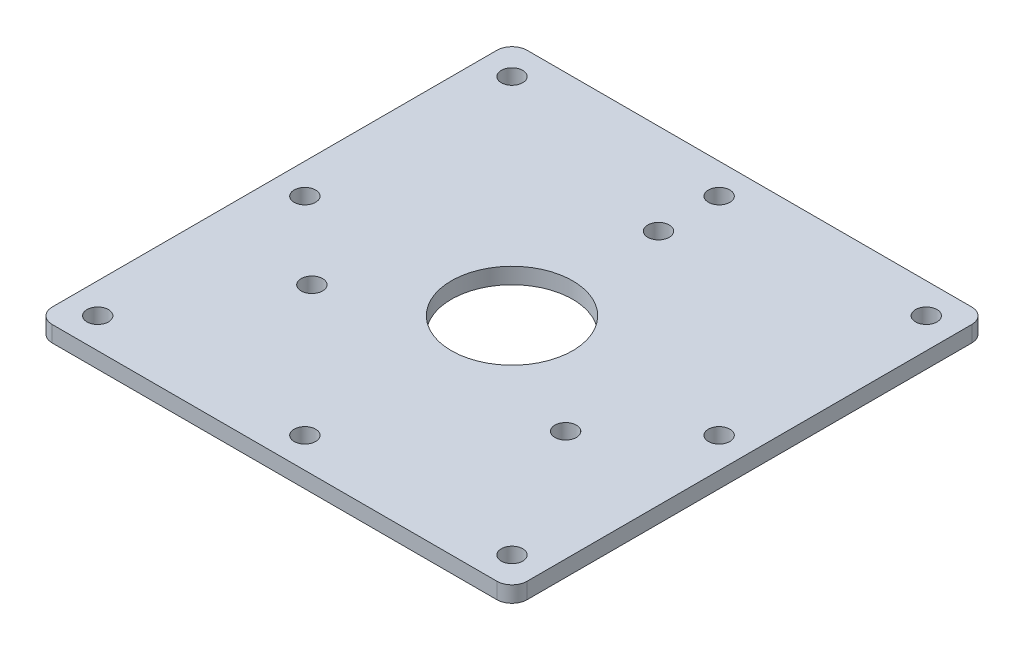
ISO-10303-21;
HEADER;
FILE_DESCRIPTION(('STEP AP214'),'2;1');
FILE_NAME('part.step','',(''),(''),'','','');
FILE_SCHEMA(('AUTOMOTIVE_DESIGN { 1 0 10303 214 1 1 1 1 }'));
ENDSEC;
DATA;
#1=APPLICATION_CONTEXT('core data for automotive mechanical design processes');
#2=APPLICATION_PROTOCOL_DEFINITION('international standard','automotive_design',2000,#1);
#3=PRODUCT_CONTEXT('',#1,'mechanical');
#4=PRODUCT('Part','Part','',(#3));
#5=PRODUCT_RELATED_PRODUCT_CATEGORY('part','',(#4));
#6=PRODUCT_DEFINITION_FORMATION('','',#4);
#7=PRODUCT_DEFINITION_CONTEXT('part definition',#1,'design');
#8=PRODUCT_DEFINITION('design','',#6,#7);
#9=PRODUCT_DEFINITION_SHAPE('','',#8);
#10=(LENGTH_UNIT() NAMED_UNIT(*) SI_UNIT(.MILLI.,.METRE.));
#11=(NAMED_UNIT(*) PLANE_ANGLE_UNIT() SI_UNIT($,.RADIAN.));
#12=(NAMED_UNIT(*) SI_UNIT($,.STERADIAN.) SOLID_ANGLE_UNIT());
#13=UNCERTAINTY_MEASURE_WITH_UNIT(LENGTH_MEASURE(1.E-05),#10,'distance_accuracy_value','');
#14=(GEOMETRIC_REPRESENTATION_CONTEXT(3) GLOBAL_UNCERTAINTY_ASSIGNED_CONTEXT((#13)) GLOBAL_UNIT_ASSIGNED_CONTEXT((#10,
#11,#12)) REPRESENTATION_CONTEXT('',''));
#15=CARTESIAN_POINT('',(0.,0.,0.));
#16=DIRECTION('',(0.,0.,1.));
#17=DIRECTION('',(1.,0.,0.));
#18=AXIS2_PLACEMENT_3D('',#15,#16,#17);
#19=CARTESIAN_POINT('',(0.,3.175,0.));
#20=DIRECTION('',(0.,-1.,0.));
#21=DIRECTION('',(0.,0.,-1.));
#22=AXIS2_PLACEMENT_3D('',#19,#20,#21);
#23=PLANE('',#22);
#24=DIRECTION('',(-1.,0.,0.));
#25=VECTOR('',#24,1.);
#26=CARTESIAN_POINT('',(-47.,3.175,-47.));
#27=LINE('',#26,#25);
#28=CARTESIAN_POINT('',(44.,3.175,-47.));
#29=VERTEX_POINT('',#28);
#30=CARTESIAN_POINT('',(-44.,3.175,-47.));
#31=VERTEX_POINT('',#30);
#32=EDGE_CURVE('E200',#29,#31,#27,.T.);
#33=ORIENTED_EDGE('',*,*,#32,.T.);
#34=CARTESIAN_POINT('',(-44.,3.175,-44.));
#35=DIRECTION('',(0.,-1.,0.));
#36=DIRECTION('',(0.,0.,-1.));
#37=AXIS2_PLACEMENT_3D('',#34,#35,#36);
#38=CIRCLE('',#37,3.);
#39=CARTESIAN_POINT('',(-47.,3.175,-44.));
#40=VERTEX_POINT('',#39);
#41=EDGE_CURVE('E173',#31,#40,#38,.F.);
#42=ORIENTED_EDGE('',*,*,#41,.T.);
#43=DIRECTION('',(0.,0.,1.));
#44=VECTOR('',#43,1.);
#45=CARTESIAN_POINT('',(-47.,3.175,47.));
#46=LINE('',#45,#44);
#47=CARTESIAN_POINT('',(-47.,3.175,44.));
#48=VERTEX_POINT('',#47);
#49=EDGE_CURVE('E130',#40,#48,#46,.T.);
#50=ORIENTED_EDGE('',*,*,#49,.T.);
#51=CARTESIAN_POINT('',(-44.,3.175,44.));
#52=DIRECTION('',(0.,-1.,0.));
#53=DIRECTION('',(0.,0.,-1.));
#54=AXIS2_PLACEMENT_3D('',#51,#52,#53);
#55=CIRCLE('',#54,3.);
#56=CARTESIAN_POINT('',(-44.,3.175,47.));
#57=VERTEX_POINT('',#56);
#58=EDGE_CURVE('E65',#48,#57,#55,.F.);
#59=ORIENTED_EDGE('',*,*,#58,.T.);
#60=DIRECTION('',(1.,0.,0.));
#61=VECTOR('',#60,1.);
#62=CARTESIAN_POINT('',(-47.,3.175,47.));
#63=LINE('',#62,#61);
#64=CARTESIAN_POINT('',(44.,3.175,47.));
#65=VERTEX_POINT('',#64);
#66=EDGE_CURVE('E151',#57,#65,#63,.T.);
#67=ORIENTED_EDGE('',*,*,#66,.T.);
#68=CARTESIAN_POINT('',(44.,3.175,44.));
#69=DIRECTION('',(0.,-1.,0.));
#70=DIRECTION('',(0.,0.,-1.));
#71=AXIS2_PLACEMENT_3D('',#68,#69,#70);
#72=CIRCLE('',#71,3.);
#73=CARTESIAN_POINT('',(47.,3.175,44.));
#74=VERTEX_POINT('',#73);
#75=EDGE_CURVE('E170',#65,#74,#72,.F.);
#76=ORIENTED_EDGE('',*,*,#75,.T.);
#77=DIRECTION('',(0.,0.,-1.));
#78=VECTOR('',#77,1.);
#79=CARTESIAN_POINT('',(47.,3.175,47.));
#80=LINE('',#79,#78);
#81=CARTESIAN_POINT('',(47.,3.175,-44.));
#82=VERTEX_POINT('',#81);
#83=EDGE_CURVE('E144',#74,#82,#80,.T.);
#84=ORIENTED_EDGE('',*,*,#83,.T.);
#85=CARTESIAN_POINT('',(44.,3.175,-44.));
#86=DIRECTION('',(0.,-1.,0.));
#87=DIRECTION('',(0.,0.,-1.));
#88=AXIS2_PLACEMENT_3D('',#85,#86,#87);
#89=CIRCLE('',#88,3.);
#90=EDGE_CURVE('E167',#82,#29,#89,.F.);
#91=ORIENTED_EDGE('',*,*,#90,.T.);
#92=EDGE_LOOP('',(#33,#42,#50,#59,#67,#76,#84,#91));
#93=FACE_BOUND('',#92,.T.);
#94=CARTESIAN_POINT('',(0.,3.175,0.));
#95=DIRECTION('',(0.,1.,0.));
#96=DIRECTION('',(0.,0.,1.));
#97=AXIS2_PLACEMENT_3D('',#94,#95,#96);
#98=CIRCLE('',#97,12.);
#99=CARTESIAN_POINT('',(0.,3.175,12.));
#100=VERTEX_POINT('',#99);
#101=EDGE_CURVE('E213',#100,#100,#98,.T.);
#102=ORIENTED_EDGE('',*,*,#101,.F.);
#103=EDGE_LOOP('',(#102));
#104=FACE_BOUND('',#103,.T.);
#105=CARTESIAN_POINT('',(0.,3.175,-29.));
#106=DIRECTION('',(0.,1.,0.));
#107=DIRECTION('',(0.,0.,1.));
#108=AXIS2_PLACEMENT_3D('',#105,#106,#107);
#109=CIRCLE('',#108,2.125);
#110=CARTESIAN_POINT('',(0.,3.175,-26.875));
#111=VERTEX_POINT('',#110);
#112=EDGE_CURVE('E220',#111,#111,#109,.T.);
#113=ORIENTED_EDGE('',*,*,#112,.F.);
#114=EDGE_LOOP('',(#113));
#115=FACE_BOUND('',#114,.T.);
#116=CARTESIAN_POINT('',(-41.,3.175,41.));
#117=DIRECTION('',(0.,1.,0.));
#118=DIRECTION('',(0.,0.,1.));
#119=AXIS2_PLACEMENT_3D('',#116,#117,#118);
#120=CIRCLE('',#119,2.125);
#121=CARTESIAN_POINT('',(-41.,3.175,43.125));
#122=VERTEX_POINT('',#121);
#123=EDGE_CURVE('E226',#122,#122,#120,.T.);
#124=ORIENTED_EDGE('',*,*,#123,.F.);
#125=EDGE_LOOP('',(#124));
#126=FACE_BOUND('',#125,.T.);
#127=CARTESIAN_POINT('',(25.1147367097506,3.175,14.4999999999989));
#128=DIRECTION('',(0.,1.,0.));
#129=DIRECTION('',(0.,0.,1.));
#130=AXIS2_PLACEMENT_3D('',#127,#128,#129);
#131=CIRCLE('',#130,2.12500000000159);
#132=CARTESIAN_POINT('',(25.1147367097506,3.175,16.6250000000005));
#133=VERTEX_POINT('',#132);
#134=EDGE_CURVE('E234',#133,#133,#131,.T.);
#135=ORIENTED_EDGE('',*,*,#134,.F.);
#136=EDGE_LOOP('',(#135));
#137=FACE_BOUND('',#136,.T.);
#138=CARTESIAN_POINT('',(-25.1147367097469,3.175,14.5000000000011));
#139=DIRECTION('',(0.,1.,0.));
#140=DIRECTION('',(0.,0.,1.));
#141=AXIS2_PLACEMENT_3D('',#138,#139,#140);
#142=CIRCLE('',#141,2.12500000000233);
#143=CARTESIAN_POINT('',(-25.1147367097469,3.175,16.6250000000034));
#144=VERTEX_POINT('',#143);
#145=EDGE_CURVE('E242',#144,#144,#142,.T.);
#146=ORIENTED_EDGE('',*,*,#145,.F.);
#147=EDGE_LOOP('',(#146));
#148=FACE_BOUND('',#147,.T.);
#149=CARTESIAN_POINT('',(-41.,3.175,0.));
#150=DIRECTION('',(0.,1.,0.));
#151=DIRECTION('',(0.,0.,1.));
#152=AXIS2_PLACEMENT_3D('',#149,#150,#151);
#153=CIRCLE('',#152,2.125);
#154=CARTESIAN_POINT('',(-41.,3.175,2.125));
#155=VERTEX_POINT('',#154);
#156=EDGE_CURVE('E250',#155,#155,#153,.T.);
#157=ORIENTED_EDGE('',*,*,#156,.F.);
#158=EDGE_LOOP('',(#157));
#159=FACE_BOUND('',#158,.T.);
#160=CARTESIAN_POINT('',(-41.,3.175,-41.));
#161=DIRECTION('',(0.,1.,0.));
#162=DIRECTION('',(0.,0.,-1.));
#163=AXIS2_PLACEMENT_3D('',#160,#161,#162);
#164=CIRCLE('',#163,2.125);
#165=CARTESIAN_POINT('',(-41.,3.175,-43.125));
#166=VERTEX_POINT('',#165);
#167=EDGE_CURVE('E258',#166,#166,#164,.T.);
#168=ORIENTED_EDGE('',*,*,#167,.F.);
#169=EDGE_LOOP('',(#168));
#170=FACE_BOUND('',#169,.T.);
#171=CARTESIAN_POINT('',(41.,3.175,41.));
#172=DIRECTION('',(0.,1.,0.));
#173=DIRECTION('',(0.,0.,-1.));
#174=AXIS2_PLACEMENT_3D('',#171,#172,#173);
#175=CIRCLE('',#174,2.125);
#176=CARTESIAN_POINT('',(41.,3.175,38.875));
#177=VERTEX_POINT('',#176);
#178=EDGE_CURVE('E266',#177,#177,#175,.T.);
#179=ORIENTED_EDGE('',*,*,#178,.F.);
#180=EDGE_LOOP('',(#179));
#181=FACE_BOUND('',#180,.T.);
#182=CARTESIAN_POINT('',(41.,3.175,0.));
#183=DIRECTION('',(0.,1.,0.));
#184=DIRECTION('',(0.,0.,-1.));
#185=AXIS2_PLACEMENT_3D('',#182,#183,#184);
#186=CIRCLE('',#185,2.125);
#187=CARTESIAN_POINT('',(41.,3.175,-2.125));
#188=VERTEX_POINT('',#187);
#189=EDGE_CURVE('E274',#188,#188,#186,.T.);
#190=ORIENTED_EDGE('',*,*,#189,.F.);
#191=EDGE_LOOP('',(#190));
#192=FACE_BOUND('',#191,.T.);
#193=CARTESIAN_POINT('',(41.,3.175,-41.));
#194=DIRECTION('',(0.,1.,0.));
#195=DIRECTION('',(0.,0.,1.));
#196=AXIS2_PLACEMENT_3D('',#193,#194,#195);
#197=CIRCLE('',#196,2.125);
#198=CARTESIAN_POINT('',(41.,3.175,-38.875));
#199=VERTEX_POINT('',#198);
#200=EDGE_CURVE('E282',#199,#199,#197,.T.);
#201=ORIENTED_EDGE('',*,*,#200,.F.);
#202=EDGE_LOOP('',(#201));
#203=FACE_BOUND('',#202,.T.);
#204=CARTESIAN_POINT('',(0.,3.175,41.));
#205=DIRECTION('',(0.,1.,0.));
#206=DIRECTION('',(0.,0.,1.));
#207=AXIS2_PLACEMENT_3D('',#204,#205,#206);
#208=CIRCLE('',#207,2.125);
#209=CARTESIAN_POINT('',(0.,3.175,43.125));
#210=VERTEX_POINT('',#209);
#211=EDGE_CURVE('E290',#210,#210,#208,.T.);
#212=ORIENTED_EDGE('',*,*,#211,.F.);
#213=EDGE_LOOP('',(#212));
#214=FACE_BOUND('',#213,.T.);
#215=CARTESIAN_POINT('',(0.,3.175,-41.));
#216=DIRECTION('',(0.,1.,0.));
#217=DIRECTION('',(0.,0.,-1.));
#218=AXIS2_PLACEMENT_3D('',#215,#216,#217);
#219=CIRCLE('',#218,2.125);
#220=CARTESIAN_POINT('',(0.,3.175,-43.125));
#221=VERTEX_POINT('',#220);
#222=EDGE_CURVE('E298',#221,#221,#219,.T.);
#223=ORIENTED_EDGE('',*,*,#222,.F.);
#224=EDGE_LOOP('',(#223));
#225=FACE_BOUND('',#224,.T.);
#226=ADVANCED_FACE('F44',(#93,#104,#115,#126,#137,#148,#159,#170,#181,#192,#203,#214,#225),#23,.F.);
#227=CARTESIAN_POINT('',(0.,0.,0.));
#228=DIRECTION('',(0.,-1.,0.));
#229=DIRECTION('',(0.,0.,-1.));
#230=AXIS2_PLACEMENT_3D('',#227,#228,#229);
#231=PLANE('',#230);
#232=CARTESIAN_POINT('',(0.,0.,41.));
#233=DIRECTION('',(0.,1.,0.));
#234=DIRECTION('',(0.,0.,1.));
#235=AXIS2_PLACEMENT_3D('',#232,#233,#234);
#236=CIRCLE('',#235,2.125);
#237=CARTESIAN_POINT('',(0.,0.,43.125));
#238=VERTEX_POINT('',#237);
#239=EDGE_CURVE('E294',#238,#238,#236,.T.);
#240=ORIENTED_EDGE('',*,*,#239,.T.);
#241=EDGE_LOOP('',(#240));
#242=FACE_BOUND('',#241,.T.);
#243=CARTESIAN_POINT('',(41.,0.,0.));
#244=DIRECTION('',(0.,1.,0.));
#245=DIRECTION('',(0.,0.,-1.));
#246=AXIS2_PLACEMENT_3D('',#243,#244,#245);
#247=CIRCLE('',#246,2.125);
#248=CARTESIAN_POINT('',(41.,0.,-2.125));
#249=VERTEX_POINT('',#248);
#250=EDGE_CURVE('E278',#249,#249,#247,.T.);
#251=ORIENTED_EDGE('',*,*,#250,.T.);
#252=EDGE_LOOP('',(#251));
#253=FACE_BOUND('',#252,.T.);
#254=CARTESIAN_POINT('',(-41.,0.,-41.));
#255=DIRECTION('',(0.,1.,0.));
#256=DIRECTION('',(0.,0.,-1.));
#257=AXIS2_PLACEMENT_3D('',#254,#255,#256);
#258=CIRCLE('',#257,2.125);
#259=CARTESIAN_POINT('',(-41.,0.,-43.125));
#260=VERTEX_POINT('',#259);
#261=EDGE_CURVE('E262',#260,#260,#258,.T.);
#262=ORIENTED_EDGE('',*,*,#261,.T.);
#263=EDGE_LOOP('',(#262));
#264=FACE_BOUND('',#263,.T.);
#265=CARTESIAN_POINT('',(-25.1147367097469,0.,14.5000000000011));
#266=DIRECTION('',(0.,1.,0.));
#267=DIRECTION('',(0.,0.,1.));
#268=AXIS2_PLACEMENT_3D('',#265,#266,#267);
#269=CIRCLE('',#268,2.12500000000233);
#270=CARTESIAN_POINT('',(-25.1147367097469,0.,16.6250000000034));
#271=VERTEX_POINT('',#270);
#272=EDGE_CURVE('E246',#271,#271,#269,.T.);
#273=ORIENTED_EDGE('',*,*,#272,.T.);
#274=EDGE_LOOP('',(#273));
#275=FACE_BOUND('',#274,.T.);
#276=CARTESIAN_POINT('',(-41.,0.,41.));
#277=DIRECTION('',(0.,1.,0.));
#278=DIRECTION('',(0.,0.,1.));
#279=AXIS2_PLACEMENT_3D('',#276,#277,#278);
#280=CIRCLE('',#279,2.125);
#281=CARTESIAN_POINT('',(-41.,0.,43.125));
#282=VERTEX_POINT('',#281);
#283=EDGE_CURVE('E230',#282,#282,#280,.T.);
#284=ORIENTED_EDGE('',*,*,#283,.T.);
#285=EDGE_LOOP('',(#284));
#286=FACE_BOUND('',#285,.T.);
#287=CARTESIAN_POINT('',(0.,0.,0.));
#288=DIRECTION('',(0.,1.,0.));
#289=DIRECTION('',(0.,0.,1.));
#290=AXIS2_PLACEMENT_3D('',#287,#288,#289);
#291=CIRCLE('',#290,12.);
#292=CARTESIAN_POINT('',(0.,0.,12.));
#293=VERTEX_POINT('',#292);
#294=EDGE_CURVE('E206',#293,#293,#291,.T.);
#295=ORIENTED_EDGE('',*,*,#294,.T.);
#296=EDGE_LOOP('',(#295));
#297=FACE_BOUND('',#296,.T.);
#298=DIRECTION('',(0.,0.,1.));
#299=VECTOR('',#298,1.);
#300=CARTESIAN_POINT('',(-47.,0.,47.));
#301=LINE('',#300,#299);
#302=CARTESIAN_POINT('',(-47.,0.,-44.));
#303=VERTEX_POINT('',#302);
#304=CARTESIAN_POINT('',(-47.,0.,44.));
#305=VERTEX_POINT('',#304);
#306=EDGE_CURVE('E128',#303,#305,#301,.T.);
#307=ORIENTED_EDGE('',*,*,#306,.F.);
#308=CARTESIAN_POINT('',(-44.,0.,-44.));
#309=DIRECTION('',(0.,-1.,0.));
#310=DIRECTION('',(0.,0.,-1.));
#311=AXIS2_PLACEMENT_3D('',#308,#309,#310);
#312=CIRCLE('',#311,3.);
#313=CARTESIAN_POINT('',(-44.,0.,-47.));
#314=VERTEX_POINT('',#313);
#315=EDGE_CURVE('E110',#303,#314,#312,.T.);
#316=ORIENTED_EDGE('',*,*,#315,.T.);
#317=DIRECTION('',(-1.,0.,0.));
#318=VECTOR('',#317,1.);
#319=CARTESIAN_POINT('',(-47.,0.,-47.));
#320=LINE('',#319,#318);
#321=CARTESIAN_POINT('',(44.,0.,-47.));
#322=VERTEX_POINT('',#321);
#323=EDGE_CURVE('E140',#322,#314,#320,.T.);
#324=ORIENTED_EDGE('',*,*,#323,.F.);
#325=CARTESIAN_POINT('',(44.,0.,-44.));
#326=DIRECTION('',(0.,-1.,0.));
#327=DIRECTION('',(0.,0.,-1.));
#328=AXIS2_PLACEMENT_3D('',#325,#326,#327);
#329=CIRCLE('',#328,3.);
#330=CARTESIAN_POINT('',(47.,0.,-44.));
#331=VERTEX_POINT('',#330);
#332=EDGE_CURVE('E155',#322,#331,#329,.T.);
#333=ORIENTED_EDGE('',*,*,#332,.T.);
#334=DIRECTION('',(0.,0.,-1.));
#335=VECTOR('',#334,1.);
#336=CARTESIAN_POINT('',(47.,0.,47.));
#337=LINE('',#336,#335);
#338=CARTESIAN_POINT('',(47.,0.,44.));
#339=VERTEX_POINT('',#338);
#340=EDGE_CURVE('E146',#339,#331,#337,.T.);
#341=ORIENTED_EDGE('',*,*,#340,.F.);
#342=CARTESIAN_POINT('',(44.,0.,44.));
#343=DIRECTION('',(0.,-1.,0.));
#344=DIRECTION('',(0.,0.,-1.));
#345=AXIS2_PLACEMENT_3D('',#342,#343,#344);
#346=CIRCLE('',#345,3.);
#347=CARTESIAN_POINT('',(44.,0.,47.));
#348=VERTEX_POINT('',#347);
#349=EDGE_CURVE('E122',#339,#348,#346,.T.);
#350=ORIENTED_EDGE('',*,*,#349,.T.);
#351=DIRECTION('',(1.,0.,0.));
#352=VECTOR('',#351,1.);
#353=CARTESIAN_POINT('',(-47.,0.,47.));
#354=LINE('',#353,#352);
#355=CARTESIAN_POINT('',(-44.,0.,47.));
#356=VERTEX_POINT('',#355);
#357=EDGE_CURVE('E139',#356,#348,#354,.T.);
#358=ORIENTED_EDGE('',*,*,#357,.F.);
#359=CARTESIAN_POINT('',(-44.,0.,44.));
#360=DIRECTION('',(0.,-1.,0.));
#361=DIRECTION('',(0.,0.,-1.));
#362=AXIS2_PLACEMENT_3D('',#359,#360,#361);
#363=CIRCLE('',#362,3.);
#364=EDGE_CURVE('E132',#356,#305,#363,.T.);
#365=ORIENTED_EDGE('',*,*,#364,.T.);
#366=EDGE_LOOP('',(#307,#316,#324,#333,#341,#350,#358,#365));
#367=FACE_BOUND('',#366,.T.);
#368=CARTESIAN_POINT('',(0.,0.,-29.));
#369=DIRECTION('',(0.,1.,0.));
#370=DIRECTION('',(0.,0.,1.));
#371=AXIS2_PLACEMENT_3D('',#368,#369,#370);
#372=CIRCLE('',#371,2.125);
#373=CARTESIAN_POINT('',(0.,0.,-26.875));
#374=VERTEX_POINT('',#373);
#375=EDGE_CURVE('E222',#374,#374,#372,.T.);
#376=ORIENTED_EDGE('',*,*,#375,.T.);
#377=EDGE_LOOP('',(#376));
#378=FACE_BOUND('',#377,.T.);
#379=CARTESIAN_POINT('',(25.1147367097506,0.,14.4999999999989));
#380=DIRECTION('',(0.,1.,0.));
#381=DIRECTION('',(0.,0.,1.));
#382=AXIS2_PLACEMENT_3D('',#379,#380,#381);
#383=CIRCLE('',#382,2.12500000000159);
#384=CARTESIAN_POINT('',(25.1147367097506,0.,16.6250000000005));
#385=VERTEX_POINT('',#384);
#386=EDGE_CURVE('E238',#385,#385,#383,.T.);
#387=ORIENTED_EDGE('',*,*,#386,.T.);
#388=EDGE_LOOP('',(#387));
#389=FACE_BOUND('',#388,.T.);
#390=CARTESIAN_POINT('',(-41.,0.,0.));
#391=DIRECTION('',(0.,1.,0.));
#392=DIRECTION('',(0.,0.,1.));
#393=AXIS2_PLACEMENT_3D('',#390,#391,#392);
#394=CIRCLE('',#393,2.125);
#395=CARTESIAN_POINT('',(-41.,0.,2.125));
#396=VERTEX_POINT('',#395);
#397=EDGE_CURVE('E254',#396,#396,#394,.T.);
#398=ORIENTED_EDGE('',*,*,#397,.T.);
#399=EDGE_LOOP('',(#398));
#400=FACE_BOUND('',#399,.T.);
#401=CARTESIAN_POINT('',(41.,0.,41.));
#402=DIRECTION('',(0.,1.,0.));
#403=DIRECTION('',(0.,0.,-1.));
#404=AXIS2_PLACEMENT_3D('',#401,#402,#403);
#405=CIRCLE('',#404,2.125);
#406=CARTESIAN_POINT('',(41.,0.,38.875));
#407=VERTEX_POINT('',#406);
#408=EDGE_CURVE('E270',#407,#407,#405,.T.);
#409=ORIENTED_EDGE('',*,*,#408,.T.);
#410=EDGE_LOOP('',(#409));
#411=FACE_BOUND('',#410,.T.);
#412=CARTESIAN_POINT('',(41.,0.,-41.));
#413=DIRECTION('',(0.,1.,0.));
#414=DIRECTION('',(0.,0.,1.));
#415=AXIS2_PLACEMENT_3D('',#412,#413,#414);
#416=CIRCLE('',#415,2.125);
#417=CARTESIAN_POINT('',(41.,0.,-38.875));
#418=VERTEX_POINT('',#417);
#419=EDGE_CURVE('E286',#418,#418,#416,.T.);
#420=ORIENTED_EDGE('',*,*,#419,.T.);
#421=EDGE_LOOP('',(#420));
#422=FACE_BOUND('',#421,.T.);
#423=CARTESIAN_POINT('',(0.,0.,-41.));
#424=DIRECTION('',(0.,1.,0.));
#425=DIRECTION('',(0.,0.,-1.));
#426=AXIS2_PLACEMENT_3D('',#423,#424,#425);
#427=CIRCLE('',#426,2.125);
#428=CARTESIAN_POINT('',(0.,0.,-43.125));
#429=VERTEX_POINT('',#428);
#430=EDGE_CURVE('E302',#429,#429,#427,.T.);
#431=ORIENTED_EDGE('',*,*,#430,.T.);
#432=EDGE_LOOP('',(#431));
#433=FACE_BOUND('',#432,.T.);
#434=ADVANCED_FACE('F135',(#242,#253,#264,#275,#286,#297,#367,#378,#389,#400,#411,#422,#433),
#231,.T.);
#435=CARTESIAN_POINT('',(47.,3.175,47.));
#436=DIRECTION('',(-1.,0.,0.));
#437=DIRECTION('',(0.,0.,1.));
#438=AXIS2_PLACEMENT_3D('',#435,#436,#437);
#439=PLANE('',#438);
#440=ORIENTED_EDGE('',*,*,#83,.F.);
#441=DIRECTION('',(0.,-1.,0.));
#442=VECTOR('',#441,1.);
#443=CARTESIAN_POINT('',(47.,3.175,44.));
#444=LINE('',#443,#442);
#445=EDGE_CURVE('E179',#74,#339,#444,.T.);
#446=ORIENTED_EDGE('',*,*,#445,.T.);
#447=ORIENTED_EDGE('',*,*,#340,.T.);
#448=DIRECTION('',(0.,-1.,0.));
#449=VECTOR('',#448,1.);
#450=CARTESIAN_POINT('',(47.,3.175,-44.));
#451=LINE('',#450,#449);
#452=EDGE_CURVE('E176',#331,#82,#451,.F.);
#453=ORIENTED_EDGE('',*,*,#452,.T.);
#454=EDGE_LOOP('',(#440,#446,#447,#453));
#455=FACE_BOUND('',#454,.T.);
#456=ADVANCED_FACE('F195',(#455),#439,.F.);
#457=CARTESIAN_POINT('',(-47.,3.175,-47.));
#458=DIRECTION('',(0.,0.,1.));
#459=DIRECTION('',(1.,0.,0.));
#460=AXIS2_PLACEMENT_3D('',#457,#458,#459);
#461=PLANE('',#460);
#462=ORIENTED_EDGE('',*,*,#323,.T.);
#463=DIRECTION('',(0.,-1.,0.));
#464=VECTOR('',#463,1.);
#465=CARTESIAN_POINT('',(-44.,3.175,-47.));
#466=LINE('',#465,#464);
#467=EDGE_CURVE('E115',#314,#31,#466,.F.);
#468=ORIENTED_EDGE('',*,*,#467,.T.);
#469=ORIENTED_EDGE('',*,*,#32,.F.);
#470=DIRECTION('',(0.,-1.,0.));
#471=VECTOR('',#470,1.);
#472=CARTESIAN_POINT('',(44.,3.175,-47.));
#473=LINE('',#472,#471);
#474=EDGE_CURVE('E121',#29,#322,#473,.T.);
#475=ORIENTED_EDGE('',*,*,#474,.T.);
#476=EDGE_LOOP('',(#462,#468,#469,#475));
#477=FACE_BOUND('',#476,.T.);
#478=ADVANCED_FACE('F330',(#477),#461,.F.);
#479=CARTESIAN_POINT('',(-47.,3.175,47.));
#480=DIRECTION('',(1.,0.,0.));
#481=DIRECTION('',(0.,0.,-1.));
#482=AXIS2_PLACEMENT_3D('',#479,#480,#481);
#483=PLANE('',#482);
#484=ORIENTED_EDGE('',*,*,#49,.F.);
#485=DIRECTION('',(0.,-1.,0.));
#486=VECTOR('',#485,1.);
#487=CARTESIAN_POINT('',(-47.,3.175,-44.));
#488=LINE('',#487,#486);
#489=EDGE_CURVE('E114',#40,#303,#488,.T.);
#490=ORIENTED_EDGE('',*,*,#489,.T.);
#491=ORIENTED_EDGE('',*,*,#306,.T.);
#492=DIRECTION('',(0.,-1.,0.));
#493=VECTOR('',#492,1.);
#494=CARTESIAN_POINT('',(-47.,3.175,44.));
#495=LINE('',#494,#493);
#496=EDGE_CURVE('E133',#305,#48,#495,.F.);
#497=ORIENTED_EDGE('',*,*,#496,.T.);
#498=EDGE_LOOP('',(#484,#490,#491,#497));
#499=FACE_BOUND('',#498,.T.);
#500=ADVANCED_FACE('F127',(#499),#483,.F.);
#501=CARTESIAN_POINT('',(-47.,3.175,47.));
#502=DIRECTION('',(0.,0.,-1.));
#503=DIRECTION('',(-1.,0.,0.));
#504=AXIS2_PLACEMENT_3D('',#501,#502,#503);
#505=PLANE('',#504);
#506=ORIENTED_EDGE('',*,*,#357,.T.);
#507=DIRECTION('',(0.,-1.,0.));
#508=VECTOR('',#507,1.);
#509=CARTESIAN_POINT('',(44.,3.175,47.));
#510=LINE('',#509,#508);
#511=EDGE_CURVE('E11',#348,#65,#510,.F.);
#512=ORIENTED_EDGE('',*,*,#511,.T.);
#513=ORIENTED_EDGE('',*,*,#66,.F.);
#514=DIRECTION('',(0.,-1.,0.));
#515=VECTOR('',#514,1.);
#516=CARTESIAN_POINT('',(-44.,3.175,47.));
#517=LINE('',#516,#515);
#518=EDGE_CURVE('E53',#57,#356,#517,.T.);
#519=ORIENTED_EDGE('',*,*,#518,.T.);
#520=EDGE_LOOP('',(#506,#512,#513,#519));
#521=FACE_BOUND('',#520,.T.);
#522=ADVANCED_FACE('F185',(#521),#505,.F.);
#523=CARTESIAN_POINT('',(0.,3.175,0.));
#524=DIRECTION('',(0.,-1.,0.));
#525=DIRECTION('',(0.,0.,-1.));
#526=AXIS2_PLACEMENT_3D('',#523,#524,#525);
#527=CYLINDRICAL_SURFACE('',#526,12.);
#528=ORIENTED_EDGE('',*,*,#101,.T.);
#529=EDGE_LOOP('',(#528));
#530=FACE_BOUND('',#529,.T.);
#531=ORIENTED_EDGE('',*,*,#294,.F.);
#532=EDGE_LOOP('',(#531));
#533=FACE_BOUND('',#532,.T.);
#534=ADVANCED_FACE('F323',(#530,#533),#527,.F.);
#535=CARTESIAN_POINT('',(0.,3.175,-29.));
#536=DIRECTION('',(0.,-1.,0.));
#537=DIRECTION('',(0.,0.,-1.));
#538=AXIS2_PLACEMENT_3D('',#535,#536,#537);
#539=CYLINDRICAL_SURFACE('',#538,2.125);
#540=ORIENTED_EDGE('',*,*,#112,.T.);
#541=EDGE_LOOP('',(#540));
#542=FACE_BOUND('',#541,.T.);
#543=ORIENTED_EDGE('',*,*,#375,.F.);
#544=EDGE_LOOP('',(#543));
#545=FACE_BOUND('',#544,.T.);
#546=ADVANCED_FACE('F463',(#542,#545),#539,.F.);
#547=CARTESIAN_POINT('',(-41.,3.175,41.));
#548=DIRECTION('',(0.,-1.,0.));
#549=DIRECTION('',(0.,0.,-1.));
#550=AXIS2_PLACEMENT_3D('',#547,#548,#549);
#551=CYLINDRICAL_SURFACE('',#550,2.125);
#552=ORIENTED_EDGE('',*,*,#123,.T.);
#553=EDGE_LOOP('',(#552));
#554=FACE_BOUND('',#553,.T.);
#555=ORIENTED_EDGE('',*,*,#283,.F.);
#556=EDGE_LOOP('',(#555));
#557=FACE_BOUND('',#556,.T.);
#558=ADVANCED_FACE('F453',(#554,#557),#551,.F.);
#559=CARTESIAN_POINT('',(25.1147367097506,3.175,14.4999999999989));
#560=DIRECTION('',(0.,-1.,0.));
#561=DIRECTION('',(0.,0.,-1.));
#562=AXIS2_PLACEMENT_3D('',#559,#560,#561);
#563=CYLINDRICAL_SURFACE('',#562,2.12500000000159);
#564=ORIENTED_EDGE('',*,*,#134,.T.);
#565=EDGE_LOOP('',(#564));
#566=FACE_BOUND('',#565,.T.);
#567=ORIENTED_EDGE('',*,*,#386,.F.);
#568=EDGE_LOOP('',(#567));
#569=FACE_BOUND('',#568,.T.);
#570=ADVANCED_FACE('F443',(#566,#569),#563,.F.);
#571=CARTESIAN_POINT('',(-25.1147367097469,3.175,14.5000000000011));
#572=DIRECTION('',(0.,-1.,0.));
#573=DIRECTION('',(0.,0.,-1.));
#574=AXIS2_PLACEMENT_3D('',#571,#572,#573);
#575=CYLINDRICAL_SURFACE('',#574,2.12500000000233);
#576=ORIENTED_EDGE('',*,*,#145,.T.);
#577=EDGE_LOOP('',(#576));
#578=FACE_BOUND('',#577,.T.);
#579=ORIENTED_EDGE('',*,*,#272,.F.);
#580=EDGE_LOOP('',(#579));
#581=FACE_BOUND('',#580,.T.);
#582=ADVANCED_FACE('F433',(#578,#581),#575,.F.);
#583=CARTESIAN_POINT('',(-41.,3.175,0.));
#584=DIRECTION('',(0.,-1.,0.));
#585=DIRECTION('',(0.,0.,-1.));
#586=AXIS2_PLACEMENT_3D('',#583,#584,#585);
#587=CYLINDRICAL_SURFACE('',#586,2.125);
#588=ORIENTED_EDGE('',*,*,#156,.T.);
#589=EDGE_LOOP('',(#588));
#590=FACE_BOUND('',#589,.T.);
#591=ORIENTED_EDGE('',*,*,#397,.F.);
#592=EDGE_LOOP('',(#591));
#593=FACE_BOUND('',#592,.T.);
#594=ADVANCED_FACE('F423',(#590,#593),#587,.F.);
#595=CARTESIAN_POINT('',(-41.,3.175,-41.));
#596=DIRECTION('',(0.,-1.,0.));
#597=DIRECTION('',(0.,0.,-1.));
#598=AXIS2_PLACEMENT_3D('',#595,#596,#597);
#599=CYLINDRICAL_SURFACE('',#598,2.125);
#600=ORIENTED_EDGE('',*,*,#167,.T.);
#601=EDGE_LOOP('',(#600));
#602=FACE_BOUND('',#601,.T.);
#603=ORIENTED_EDGE('',*,*,#261,.F.);
#604=EDGE_LOOP('',(#603));
#605=FACE_BOUND('',#604,.T.);
#606=ADVANCED_FACE('F413',(#602,#605),#599,.F.);
#607=CARTESIAN_POINT('',(41.,3.175,41.));
#608=DIRECTION('',(0.,-1.,0.));
#609=DIRECTION('',(0.,0.,-1.));
#610=AXIS2_PLACEMENT_3D('',#607,#608,#609);
#611=CYLINDRICAL_SURFACE('',#610,2.125);
#612=ORIENTED_EDGE('',*,*,#178,.T.);
#613=EDGE_LOOP('',(#612));
#614=FACE_BOUND('',#613,.T.);
#615=ORIENTED_EDGE('',*,*,#408,.F.);
#616=EDGE_LOOP('',(#615));
#617=FACE_BOUND('',#616,.T.);
#618=ADVANCED_FACE('F403',(#614,#617),#611,.F.);
#619=CARTESIAN_POINT('',(41.,3.175,0.));
#620=DIRECTION('',(0.,-1.,0.));
#621=DIRECTION('',(0.,0.,-1.));
#622=AXIS2_PLACEMENT_3D('',#619,#620,#621);
#623=CYLINDRICAL_SURFACE('',#622,2.125);
#624=ORIENTED_EDGE('',*,*,#189,.T.);
#625=EDGE_LOOP('',(#624));
#626=FACE_BOUND('',#625,.T.);
#627=ORIENTED_EDGE('',*,*,#250,.F.);
#628=EDGE_LOOP('',(#627));
#629=FACE_BOUND('',#628,.T.);
#630=ADVANCED_FACE('F393',(#626,#629),#623,.F.);
#631=CARTESIAN_POINT('',(41.,3.175,-41.));
#632=DIRECTION('',(0.,-1.,0.));
#633=DIRECTION('',(0.,0.,-1.));
#634=AXIS2_PLACEMENT_3D('',#631,#632,#633);
#635=CYLINDRICAL_SURFACE('',#634,2.125);
#636=ORIENTED_EDGE('',*,*,#200,.T.);
#637=EDGE_LOOP('',(#636));
#638=FACE_BOUND('',#637,.T.);
#639=ORIENTED_EDGE('',*,*,#419,.F.);
#640=EDGE_LOOP('',(#639));
#641=FACE_BOUND('',#640,.T.);
#642=ADVANCED_FACE('F383',(#638,#641),#635,.F.);
#643=CARTESIAN_POINT('',(0.,3.175,41.));
#644=DIRECTION('',(0.,-1.,0.));
#645=DIRECTION('',(0.,0.,-1.));
#646=AXIS2_PLACEMENT_3D('',#643,#644,#645);
#647=CYLINDRICAL_SURFACE('',#646,2.125);
#648=ORIENTED_EDGE('',*,*,#211,.T.);
#649=EDGE_LOOP('',(#648));
#650=FACE_BOUND('',#649,.T.);
#651=ORIENTED_EDGE('',*,*,#239,.F.);
#652=EDGE_LOOP('',(#651));
#653=FACE_BOUND('',#652,.T.);
#654=ADVANCED_FACE('F374',(#650,#653),#647,.F.);
#655=CARTESIAN_POINT('',(0.,3.175,-41.));
#656=DIRECTION('',(0.,-1.,0.));
#657=DIRECTION('',(0.,0.,-1.));
#658=AXIS2_PLACEMENT_3D('',#655,#656,#657);
#659=CYLINDRICAL_SURFACE('',#658,2.125);
#660=ORIENTED_EDGE('',*,*,#222,.T.);
#661=EDGE_LOOP('',(#660));
#662=FACE_BOUND('',#661,.T.);
#663=ORIENTED_EDGE('',*,*,#430,.F.);
#664=EDGE_LOOP('',(#663));
#665=FACE_BOUND('',#664,.T.);
#666=ADVANCED_FACE('F310',(#662,#665),#659,.F.);
#667=CARTESIAN_POINT('',(-44.,3.175,-44.));
#668=DIRECTION('',(0.,-1.,0.));
#669=DIRECTION('',(0.,0.,-1.));
#670=AXIS2_PLACEMENT_3D('',#667,#668,#669);
#671=CYLINDRICAL_SURFACE('',#670,3.);
#672=ORIENTED_EDGE('',*,*,#41,.F.);
#673=ORIENTED_EDGE('',*,*,#467,.F.);
#674=ORIENTED_EDGE('',*,*,#315,.F.);
#675=ORIENTED_EDGE('',*,*,#489,.F.);
#676=EDGE_LOOP('',(#672,#673,#674,#675));
#677=FACE_BOUND('',#676,.T.);
#678=ADVANCED_FACE('F113',(#677),#671,.T.);
#679=CARTESIAN_POINT('',(44.,3.175,44.));
#680=DIRECTION('',(0.,-1.,0.));
#681=DIRECTION('',(0.,0.,-1.));
#682=AXIS2_PLACEMENT_3D('',#679,#680,#681);
#683=CYLINDRICAL_SURFACE('',#682,3.);
#684=ORIENTED_EDGE('',*,*,#75,.F.);
#685=ORIENTED_EDGE('',*,*,#511,.F.);
#686=ORIENTED_EDGE('',*,*,#349,.F.);
#687=ORIENTED_EDGE('',*,*,#445,.F.);
#688=EDGE_LOOP('',(#684,#685,#686,#687));
#689=FACE_BOUND('',#688,.T.);
#690=ADVANCED_FACE('F192',(#689),#683,.T.);
#691=CARTESIAN_POINT('',(44.,3.175,-44.));
#692=DIRECTION('',(0.,-1.,0.));
#693=DIRECTION('',(0.,0.,-1.));
#694=AXIS2_PLACEMENT_3D('',#691,#692,#693);
#695=CYLINDRICAL_SURFACE('',#694,3.);
#696=ORIENTED_EDGE('',*,*,#90,.F.);
#697=ORIENTED_EDGE('',*,*,#452,.F.);
#698=ORIENTED_EDGE('',*,*,#332,.F.);
#699=ORIENTED_EDGE('',*,*,#474,.F.);
#700=EDGE_LOOP('',(#696,#697,#698,#699));
#701=FACE_BOUND('',#700,.T.);
#702=ADVANCED_FACE('F339',(#701),#695,.T.);
#703=CARTESIAN_POINT('',(-44.,3.175,44.));
#704=DIRECTION('',(0.,-1.,0.));
#705=DIRECTION('',(0.,0.,-1.));
#706=AXIS2_PLACEMENT_3D('',#703,#704,#705);
#707=CYLINDRICAL_SURFACE('',#706,3.);
#708=ORIENTED_EDGE('',*,*,#58,.F.);
#709=ORIENTED_EDGE('',*,*,#496,.F.);
#710=ORIENTED_EDGE('',*,*,#364,.F.);
#711=ORIENTED_EDGE('',*,*,#518,.F.);
#712=EDGE_LOOP('',(#708,#709,#710,#711));
#713=FACE_BOUND('',#712,.T.);
#714=ADVANCED_FACE('F46',(#713),#707,.T.);
#715=CLOSED_SHELL('',(#226,#434,#456,#478,#500,#522,#534,#546,#558,#570,#582,#594,#606,#618,
#630,#642,#654,#666,#678,#690,#702,#714));
#716=MANIFOLD_SOLID_BREP('B2',#715);
#717=ADVANCED_BREP_SHAPE_REPRESENTATION('',(#18,#716),#14);
#718=SHAPE_DEFINITION_REPRESENTATION(#9,#717);
ENDSEC;
END-ISO-10303-21;
